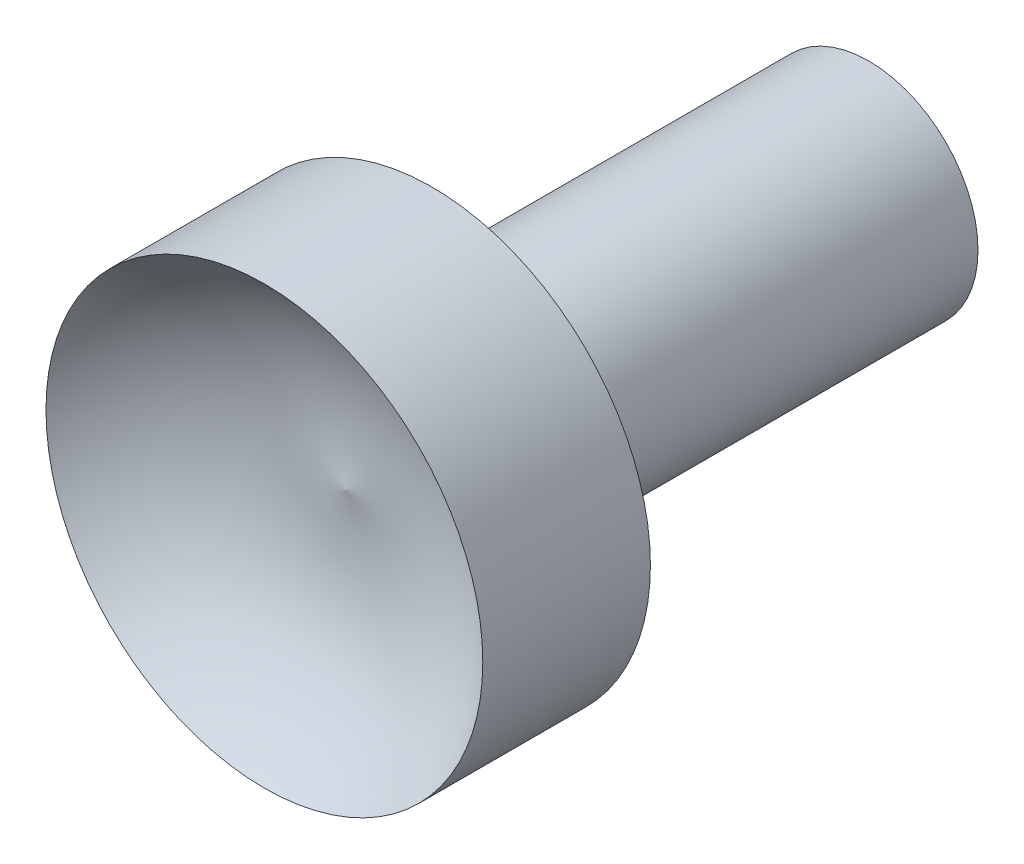
ISO-10303-21;
HEADER;
FILE_DESCRIPTION(('STEP AP214'),'2;1');
FILE_NAME('part.step','',(''),(''),'','','');
FILE_SCHEMA(('AUTOMOTIVE_DESIGN { 1 0 10303 214 1 1 1 1 }'));
ENDSEC;
DATA;
#1=APPLICATION_CONTEXT('core data for automotive mechanical design processes');
#2=APPLICATION_PROTOCOL_DEFINITION('international standard','automotive_design',2000,#1);
#3=PRODUCT_CONTEXT('',#1,'mechanical');
#4=PRODUCT('Part','Part','',(#3));
#5=PRODUCT_RELATED_PRODUCT_CATEGORY('part','',(#4));
#6=PRODUCT_DEFINITION_FORMATION('','',#4);
#7=PRODUCT_DEFINITION_CONTEXT('part definition',#1,'design');
#8=PRODUCT_DEFINITION('design','',#6,#7);
#9=PRODUCT_DEFINITION_SHAPE('','',#8);
#10=(LENGTH_UNIT() NAMED_UNIT(*) SI_UNIT(.MILLI.,.METRE.));
#11=(NAMED_UNIT(*) PLANE_ANGLE_UNIT() SI_UNIT($,.RADIAN.));
#12=(NAMED_UNIT(*) SI_UNIT($,.STERADIAN.) SOLID_ANGLE_UNIT());
#13=UNCERTAINTY_MEASURE_WITH_UNIT(LENGTH_MEASURE(1.E-05),#10,'distance_accuracy_value','');
#14=(GEOMETRIC_REPRESENTATION_CONTEXT(3) GLOBAL_UNCERTAINTY_ASSIGNED_CONTEXT((#13)) GLOBAL_UNIT_ASSIGNED_CONTEXT((#10,
#11,#12)) REPRESENTATION_CONTEXT('',''));
#15=CARTESIAN_POINT('',(0.,0.,0.));
#16=DIRECTION('',(0.,0.,1.));
#17=DIRECTION('',(1.,0.,0.));
#18=AXIS2_PLACEMENT_3D('',#15,#16,#17);
#19=CARTESIAN_POINT('',(0.,0.,6.));
#20=DIRECTION('',(0.,0.,-1.));
#21=DIRECTION('',(-1.,0.,0.));
#22=AXIS2_PLACEMENT_3D('',#19,#20,#21);
#23=CYLINDRICAL_SURFACE('',#22,5.);
#24=CARTESIAN_POINT('',(0.,0.,3.83772233983162));
#25=DIRECTION('',(0.,0.,1.));
#26=DIRECTION('',(1.,0.,0.));
#27=AXIS2_PLACEMENT_3D('',#24,#25,#26);
#28=CIRCLE('',#27,5.);
#29=CARTESIAN_POINT('',(5.,0.,3.83772233983162));
#30=VERTEX_POINT('',#29);
#31=EDGE_CURVE('E50',#30,#30,#28,.F.);
#32=ORIENTED_EDGE('',*,*,#31,.T.);
#33=EDGE_LOOP('',(#32));
#34=FACE_BOUND('',#33,.T.);
#35=CARTESIAN_POINT('',(0.,0.,0.));
#36=DIRECTION('',(0.,0.,1.));
#37=DIRECTION('',(1.,0.,0.));
#38=AXIS2_PLACEMENT_3D('',#35,#36,#37);
#39=CIRCLE('',#38,5.);
#40=CARTESIAN_POINT('',(5.,0.,0.));
#41=VERTEX_POINT('',#40);
#42=EDGE_CURVE('E39',#41,#41,#39,.T.);
#43=ORIENTED_EDGE('',*,*,#42,.T.);
#44=EDGE_LOOP('',(#43));
#45=FACE_BOUND('',#44,.T.);
#46=ADVANCED_FACE('F33',(#34,#45),#23,.T.);
#47=CARTESIAN_POINT('',(0.,0.,0.));
#48=DIRECTION('',(0.,0.,1.));
#49=DIRECTION('',(1.,0.,0.));
#50=AXIS2_PLACEMENT_3D('',#47,#48,#49);
#51=PLANE('',#50);
#52=CARTESIAN_POINT('',(0.,0.,0.));
#53=DIRECTION('',(0.,0.,1.));
#54=DIRECTION('',(1.,0.,0.));
#55=AXIS2_PLACEMENT_3D('',#52,#53,#54);
#56=CIRCLE('',#55,2.5);
#57=CARTESIAN_POINT('',(2.5,0.,0.));
#58=VERTEX_POINT('',#57);
#59=EDGE_CURVE('E11',#58,#58,#56,.F.);
#60=ORIENTED_EDGE('',*,*,#59,.F.);
#61=EDGE_LOOP('',(#60));
#62=FACE_BOUND('',#61,.T.);
#63=ORIENTED_EDGE('',*,*,#42,.F.);
#64=EDGE_LOOP('',(#63));
#65=FACE_BOUND('',#64,.T.);
#66=ADVANCED_FACE('F46',(#62,#65),#51,.F.);
#67=CARTESIAN_POINT('',(-1.,0.,6.99999999999999));
#68=DIRECTION('',(0.,-1.,0.));
#69=DIRECTION('',(-1.,0.,0.));
#70=AXIS2_PLACEMENT_3D('',#67,#68,#69);
#71=CIRCLE('',#70,5.09901951359278);
#72=TRIMMED_CURVE('',#71,(PARAMETER_VALUE(-1.76819188664478)),
(PARAMETER_VALUE(1.76819188664478)),.T.,.PARAMETER.);
#73=CARTESIAN_POINT('',(0.,0.,6.99999999999999));
#74=DIRECTION('',(0.,0.,-1.));
#75=AXIS1_PLACEMENT('',#73,#74);
#76=SURFACE_OF_REVOLUTION('',#72,#75);
#77=CARTESIAN_POINT('',(0.,0.,2.));
#78=VERTEX_POINT('',#77);
#79=VERTEX_LOOP('',#78);
#80=FACE_BOUND('',#79,.T.);
#81=ORIENTED_EDGE('',*,*,#31,.F.);
#82=EDGE_LOOP('',(#81));
#83=FACE_BOUND('',#82,.T.);
#84=ADVANCED_FACE('F42',(#80,#83),#76,.F.);
#85=CARTESIAN_POINT('',(0.,0.,-10.));
#86=DIRECTION('',(0.,0.,1.));
#87=DIRECTION('',(1.,0.,0.));
#88=AXIS2_PLACEMENT_3D('',#85,#86,#87);
#89=CYLINDRICAL_SURFACE('',#88,2.5);
#90=CARTESIAN_POINT('',(0.,0.,-10.));
#91=DIRECTION('',(0.,0.,-1.));
#92=DIRECTION('',(-1.,0.,0.));
#93=AXIS2_PLACEMENT_3D('',#90,#91,#92);
#94=CIRCLE('',#93,2.5);
#95=CARTESIAN_POINT('',(-2.5,0.,-10.));
#96=VERTEX_POINT('',#95);
#97=EDGE_CURVE('E52',#96,#96,#94,.T.);
#98=ORIENTED_EDGE('',*,*,#97,.F.);
#99=EDGE_LOOP('',(#98));
#100=FACE_BOUND('',#99,.T.);
#101=ORIENTED_EDGE('',*,*,#59,.T.);
#102=EDGE_LOOP('',(#101));
#103=FACE_BOUND('',#102,.T.);
#104=ADVANCED_FACE('F45',(#100,#103),#89,.T.);
#105=CARTESIAN_POINT('',(0.,0.,-10.));
#106=DIRECTION('',(0.,0.,-1.));
#107=DIRECTION('',(-1.,0.,0.));
#108=AXIS2_PLACEMENT_3D('',#105,#106,#107);
#109=PLANE('',#108);
#110=ORIENTED_EDGE('',*,*,#97,.T.);
#111=EDGE_LOOP('',(#110));
#112=FACE_BOUND('',#111,.T.);
#113=ADVANCED_FACE('F59',(#112),#109,.T.);
#114=CLOSED_SHELL('',(#46,#66,#84,#104,#113));
#115=MANIFOLD_SOLID_BREP('B2',#114);
#116=ADVANCED_BREP_SHAPE_REPRESENTATION('',(#18,#115),#14);
#117=SHAPE_DEFINITION_REPRESENTATION(#9,#116);
ENDSEC;
END-ISO-10303-21;
